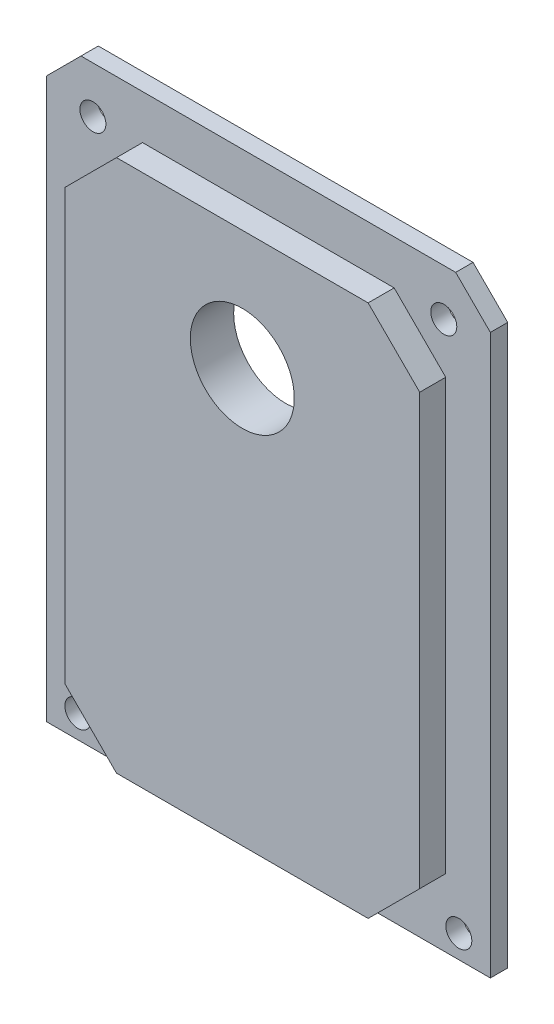
ISO-10303-21;
HEADER;
FILE_DESCRIPTION(('STEP AP214'),'2;1');
FILE_NAME('part.step','',(''),(''),'','','');
FILE_SCHEMA(('AUTOMOTIVE_DESIGN { 1 0 10303 214 1 1 1 1 }'));
ENDSEC;
DATA;
#1=APPLICATION_CONTEXT('core data for automotive mechanical design processes');
#2=APPLICATION_PROTOCOL_DEFINITION('international standard','automotive_design',2000,#1);
#3=PRODUCT_CONTEXT('',#1,'mechanical');
#4=PRODUCT('Part','Part','',(#3));
#5=PRODUCT_RELATED_PRODUCT_CATEGORY('part','',(#4));
#6=PRODUCT_DEFINITION_FORMATION('','',#4);
#7=PRODUCT_DEFINITION_CONTEXT('part definition',#1,'design');
#8=PRODUCT_DEFINITION('design','',#6,#7);
#9=PRODUCT_DEFINITION_SHAPE('','',#8);
#10=(LENGTH_UNIT() NAMED_UNIT(*) SI_UNIT(.MILLI.,.METRE.));
#11=(NAMED_UNIT(*) PLANE_ANGLE_UNIT() SI_UNIT($,.RADIAN.));
#12=(NAMED_UNIT(*) SI_UNIT($,.STERADIAN.) SOLID_ANGLE_UNIT());
#13=UNCERTAINTY_MEASURE_WITH_UNIT(LENGTH_MEASURE(1.E-05),#10,'distance_accuracy_value','');
#14=(GEOMETRIC_REPRESENTATION_CONTEXT(3) GLOBAL_UNCERTAINTY_ASSIGNED_CONTEXT((#13)) GLOBAL_UNIT_ASSIGNED_CONTEXT((#10,
#11,#12)) REPRESENTATION_CONTEXT('',''));
#15=CARTESIAN_POINT('',(0.,0.,0.));
#16=DIRECTION('',(0.,0.,1.));
#17=DIRECTION('',(1.,0.,0.));
#18=AXIS2_PLACEMENT_3D('',#15,#16,#17);
#19=CARTESIAN_POINT('',(0.,0.,2.));
#20=DIRECTION('',(0.,0.,-1.));
#21=DIRECTION('',(-1.,0.,0.));
#22=AXIS2_PLACEMENT_3D('',#19,#20,#21);
#23=PLANE('',#22);
#24=CARTESIAN_POINT('',(-21.9744235253127,-31.6049663646839,2.));
#25=DIRECTION('',(0.,0.,1.));
#26=DIRECTION('',(1.,0.,0.));
#27=AXIS2_PLACEMENT_3D('',#24,#25,#26);
#28=CIRCLE('',#27,1.5);
#29=CARTESIAN_POINT('',(-20.4744235253127,-31.6049663646839,2.));
#30=VERTEX_POINT('',#29);
#31=EDGE_CURVE('E528',#30,#30,#28,.T.);
#32=ORIENTED_EDGE('',*,*,#31,.F.);
#33=EDGE_LOOP('',(#32));
#34=FACE_BOUND('',#33,.T.);
#35=CARTESIAN_POINT('',(21.9744235253127,-31.6049663646839,2.));
#36=DIRECTION('',(0.,0.,1.));
#37=DIRECTION('',(1.,0.,0.));
#38=AXIS2_PLACEMENT_3D('',#35,#36,#37);
#39=CIRCLE('',#38,1.5);
#40=CARTESIAN_POINT('',(23.4744235253127,-31.6049663646839,2.));
#41=VERTEX_POINT('',#40);
#42=EDGE_CURVE('E544',#41,#41,#39,.T.);
#43=ORIENTED_EDGE('',*,*,#42,.F.);
#44=EDGE_LOOP('',(#43));
#45=FACE_BOUND('',#44,.T.);
#46=CARTESIAN_POINT('',(20.2421006537402,28.8771006537402,2.));
#47=DIRECTION('',(0.,0.,1.));
#48=DIRECTION('',(1.,0.,0.));
#49=AXIS2_PLACEMENT_3D('',#46,#47,#48);
#50=CIRCLE('',#49,1.5);
#51=CARTESIAN_POINT('',(21.7421006537402,28.8771006537402,2.));
#52=VERTEX_POINT('',#51);
#53=EDGE_CURVE('E536',#52,#52,#50,.T.);
#54=ORIENTED_EDGE('',*,*,#53,.F.);
#55=EDGE_LOOP('',(#54));
#56=FACE_BOUND('',#55,.T.);
#57=CARTESIAN_POINT('',(-20.2421006537402,28.8771006537402,2.));
#58=DIRECTION('',(0.,0.,1.));
#59=DIRECTION('',(1.,0.,0.));
#60=AXIS2_PLACEMENT_3D('',#57,#58,#59);
#61=CIRCLE('',#60,1.5);
#62=CARTESIAN_POINT('',(-18.7421006537402,28.8771006537402,2.));
#63=VERTEX_POINT('',#62);
#64=EDGE_CURVE('E535',#63,#63,#61,.T.);
#65=ORIENTED_EDGE('',*,*,#64,.F.);
#66=EDGE_LOOP('',(#65));
#67=FACE_BOUND('',#66,.T.);
#68=DIRECTION('',(0.,1.,0.));
#69=VECTOR('',#68,1.);
#70=CARTESIAN_POINT('',(25.615,-34.25,2.));
#71=LINE('',#70,#69);
#72=CARTESIAN_POINT('',(25.615,-34.25,2.));
#73=VERTEX_POINT('',#72);
#74=CARTESIAN_POINT('',(25.615,30.25,2.));
#75=VERTEX_POINT('',#74);
#76=EDGE_CURVE('E187',#73,#75,#71,.T.);
#77=ORIENTED_EDGE('',*,*,#76,.T.);
#78=DIRECTION('',(0.707106781186547,-0.707106781186548,0.));
#79=VECTOR('',#78,1.);
#80=CARTESIAN_POINT('',(21.615,34.25,2.));
#81=LINE('',#80,#79);
#82=CARTESIAN_POINT('',(21.615,34.25,2.));
#83=VERTEX_POINT('',#82);
#84=EDGE_CURVE('E206',#75,#83,#81,.F.);
#85=ORIENTED_EDGE('',*,*,#84,.T.);
#86=DIRECTION('',(-1.,0.,0.));
#87=VECTOR('',#86,1.);
#88=CARTESIAN_POINT('',(-25.615,34.25,2.));
#89=LINE('',#88,#87);
#90=CARTESIAN_POINT('',(-21.615,34.25,2.));
#91=VERTEX_POINT('',#90);
#92=EDGE_CURVE('E152',#83,#91,#89,.T.);
#93=ORIENTED_EDGE('',*,*,#92,.T.);
#94=DIRECTION('',(0.707106781186549,0.707106781186546,0.));
#95=VECTOR('',#94,1.);
#96=CARTESIAN_POINT('',(-25.615,30.25,2.));
#97=LINE('',#96,#95);
#98=CARTESIAN_POINT('',(-25.615,30.25,2.));
#99=VERTEX_POINT('',#98);
#100=EDGE_CURVE('E147',#91,#99,#97,.F.);
#101=ORIENTED_EDGE('',*,*,#100,.T.);
#102=DIRECTION('',(0.,-1.,0.));
#103=VECTOR('',#102,1.);
#104=CARTESIAN_POINT('',(-25.615,-34.25,2.));
#105=LINE('',#104,#103);
#106=CARTESIAN_POINT('',(-25.615,-34.25,2.));
#107=VERTEX_POINT('',#106);
#108=EDGE_CURVE('E139',#99,#107,#105,.T.);
#109=ORIENTED_EDGE('',*,*,#108,.T.);
#110=DIRECTION('',(1.,0.,0.));
#111=VECTOR('',#110,1.);
#112=CARTESIAN_POINT('',(-25.615,-34.25,2.));
#113=LINE('',#112,#111);
#114=EDGE_CURVE('E143',#107,#73,#113,.T.);
#115=ORIENTED_EDGE('',*,*,#114,.T.);
#116=EDGE_LOOP('',(#77,#85,#93,#101,#109,#115));
#117=FACE_BOUND('',#116,.T.);
#118=DIRECTION('',(0.,1.,0.));
#119=VECTOR('',#118,1.);
#120=CARTESIAN_POINT('',(20.465,-32.35,2.));
#121=LINE('',#120,#119);
#122=CARTESIAN_POINT('',(20.465,-26.4,2.));
#123=VERTEX_POINT('',#122);
#124=CARTESIAN_POINT('',(20.465,23.2,2.));
#125=VERTEX_POINT('',#124);
#126=EDGE_CURVE('E292',#123,#125,#121,.T.);
#127=ORIENTED_EDGE('',*,*,#126,.F.);
#128=DIRECTION('',(0.707106781186549,0.707106781186546,0.));
#129=VECTOR('',#128,1.);
#130=CARTESIAN_POINT('',(23.4324999999999,-23.4325000000001,2.));
#131=LINE('',#130,#129);
#132=CARTESIAN_POINT('',(14.515,-32.35,2.));
#133=VERTEX_POINT('',#132);
#134=EDGE_CURVE('E251',#123,#133,#131,.F.);
#135=ORIENTED_EDGE('',*,*,#134,.T.);
#136=DIRECTION('',(1.,0.,0.));
#137=VECTOR('',#136,1.);
#138=CARTESIAN_POINT('',(-20.465,-32.35,2.));
#139=LINE('',#138,#137);
#140=CARTESIAN_POINT('',(-14.515,-32.35,2.));
#141=VERTEX_POINT('',#140);
#142=EDGE_CURVE('E262',#141,#133,#139,.T.);
#143=ORIENTED_EDGE('',*,*,#142,.F.);
#144=DIRECTION('',(0.707106781186547,-0.707106781186548,0.));
#145=VECTOR('',#144,1.);
#146=CARTESIAN_POINT('',(-23.4325,-23.4325,2.));
#147=LINE('',#146,#145);
#148=CARTESIAN_POINT('',(-20.465,-26.4,2.));
#149=VERTEX_POINT('',#148);
#150=EDGE_CURVE('E254',#141,#149,#147,.F.);
#151=ORIENTED_EDGE('',*,*,#150,.T.);
#152=DIRECTION('',(0.,-1.,0.));
#153=VECTOR('',#152,1.);
#154=CARTESIAN_POINT('',(-20.465,-32.35,2.));
#155=LINE('',#154,#153);
#156=CARTESIAN_POINT('',(-20.465,23.2,2.));
#157=VERTEX_POINT('',#156);
#158=EDGE_CURVE('E260',#157,#149,#155,.T.);
#159=ORIENTED_EDGE('',*,*,#158,.F.);
#160=DIRECTION('',(-0.707106781186549,-0.707106781186546,0.));
#161=VECTOR('',#160,1.);
#162=CARTESIAN_POINT('',(-21.8325,21.8325000000001,2.));
#163=LINE('',#162,#161);
#164=CARTESIAN_POINT('',(-14.515,29.15,2.));
#165=VERTEX_POINT('',#164);
#166=EDGE_CURVE('E48',#157,#165,#163,.F.);
#167=ORIENTED_EDGE('',*,*,#166,.T.);
#168=DIRECTION('',(-1.,0.,0.));
#169=VECTOR('',#168,1.);
#170=CARTESIAN_POINT('',(-20.465,29.15,2.));
#171=LINE('',#170,#169);
#172=CARTESIAN_POINT('',(14.515,29.15,2.));
#173=VERTEX_POINT('',#172);
#174=EDGE_CURVE('E272',#173,#165,#171,.T.);
#175=ORIENTED_EDGE('',*,*,#174,.F.);
#176=DIRECTION('',(-0.707106781186547,0.707106781186548,0.));
#177=VECTOR('',#176,1.);
#178=CARTESIAN_POINT('',(21.8325,21.8325,2.));
#179=LINE('',#178,#177);
#180=EDGE_CURVE('E11',#173,#125,#179,.F.);
#181=ORIENTED_EDGE('',*,*,#180,.T.);
#182=EDGE_LOOP('',(#127,#135,#143,#151,#159,#167,#175,#181));
#183=FACE_BOUND('',#182,.T.);
#184=ADVANCED_FACE('F39',(#34,#45,#56,#67,#117,#183),#23,.F.);
#185=CARTESIAN_POINT('',(25.615,-34.25,2.));
#186=DIRECTION('',(-1.,0.,0.));
#187=DIRECTION('',(0.,0.,1.));
#188=AXIS2_PLACEMENT_3D('',#185,#186,#187);
#189=PLANE('',#188);
#190=DIRECTION('',(0.,1.,0.));
#191=VECTOR('',#190,1.);
#192=CARTESIAN_POINT('',(25.615,-34.25,0.));
#193=LINE('',#192,#191);
#194=CARTESIAN_POINT('',(25.615,-34.25,0.));
#195=VERTEX_POINT('',#194);
#196=CARTESIAN_POINT('',(25.615,30.25,0.));
#197=VERTEX_POINT('',#196);
#198=EDGE_CURVE('E174',#195,#197,#193,.T.);
#199=ORIENTED_EDGE('',*,*,#198,.T.);
#200=DIRECTION('',(0.,0.,1.));
#201=VECTOR('',#200,1.);
#202=CARTESIAN_POINT('',(25.615,30.25,2.));
#203=LINE('',#202,#201);
#204=EDGE_CURVE('E201',#197,#75,#203,.T.);
#205=ORIENTED_EDGE('',*,*,#204,.T.);
#206=ORIENTED_EDGE('',*,*,#76,.F.);
#207=DIRECTION('',(0.,0.,-1.));
#208=VECTOR('',#207,1.);
#209=CARTESIAN_POINT('',(25.615,-34.25,2.));
#210=LINE('',#209,#208);
#211=EDGE_CURVE('E163',#73,#195,#210,.T.);
#212=ORIENTED_EDGE('',*,*,#211,.T.);
#213=EDGE_LOOP('',(#199,#205,#206,#212));
#214=FACE_BOUND('',#213,.T.);
#215=ADVANCED_FACE('F316',(#214),#189,.F.);
#216=CARTESIAN_POINT('',(-25.615,34.25,2.));
#217=DIRECTION('',(0.,-1.,0.));
#218=DIRECTION('',(0.,0.,-1.));
#219=AXIS2_PLACEMENT_3D('',#216,#217,#218);
#220=PLANE('',#219);
#221=ORIENTED_EDGE('',*,*,#92,.F.);
#222=DIRECTION('',(0.,0.,-1.));
#223=VECTOR('',#222,1.);
#224=CARTESIAN_POINT('',(21.615,34.25,2.));
#225=LINE('',#224,#223);
#226=CARTESIAN_POINT('',(21.615,34.25,0.));
#227=VERTEX_POINT('',#226);
#228=EDGE_CURVE('E191',#83,#227,#225,.T.);
#229=ORIENTED_EDGE('',*,*,#228,.T.);
#230=DIRECTION('',(-1.,0.,0.));
#231=VECTOR('',#230,1.);
#232=CARTESIAN_POINT('',(-25.615,34.25,0.));
#233=LINE('',#232,#231);
#234=CARTESIAN_POINT('',(-21.615,34.25,0.));
#235=VERTEX_POINT('',#234);
#236=EDGE_CURVE('E178',#227,#235,#233,.T.);
#237=ORIENTED_EDGE('',*,*,#236,.T.);
#238=DIRECTION('',(0.,0.,1.));
#239=VECTOR('',#238,1.);
#240=CARTESIAN_POINT('',(-21.615,34.25,2.));
#241=LINE('',#240,#239);
#242=EDGE_CURVE('E162',#235,#91,#241,.T.);
#243=ORIENTED_EDGE('',*,*,#242,.T.);
#244=EDGE_LOOP('',(#221,#229,#237,#243));
#245=FACE_BOUND('',#244,.T.);
#246=ADVANCED_FACE('F320',(#245),#220,.F.);
#247=CARTESIAN_POINT('',(-25.615,-34.25,2.));
#248=DIRECTION('',(1.,0.,0.));
#249=DIRECTION('',(0.,0.,-1.));
#250=AXIS2_PLACEMENT_3D('',#247,#248,#249);
#251=PLANE('',#250);
#252=ORIENTED_EDGE('',*,*,#108,.F.);
#253=DIRECTION('',(0.,0.,-1.));
#254=VECTOR('',#253,1.);
#255=CARTESIAN_POINT('',(-25.615,30.25,2.));
#256=LINE('',#255,#254);
#257=CARTESIAN_POINT('',(-25.615,30.25,0.));
#258=VERTEX_POINT('',#257);
#259=EDGE_CURVE('E209',#99,#258,#256,.T.);
#260=ORIENTED_EDGE('',*,*,#259,.T.);
#261=DIRECTION('',(0.,-1.,0.));
#262=VECTOR('',#261,1.);
#263=CARTESIAN_POINT('',(-25.615,-34.25,0.));
#264=LINE('',#263,#262);
#265=CARTESIAN_POINT('',(-25.615,-34.25,0.));
#266=VERTEX_POINT('',#265);
#267=EDGE_CURVE('E158',#258,#266,#264,.T.);
#268=ORIENTED_EDGE('',*,*,#267,.T.);
#269=DIRECTION('',(0.,0.,-1.));
#270=VECTOR('',#269,1.);
#271=CARTESIAN_POINT('',(-25.615,-34.25,2.));
#272=LINE('',#271,#270);
#273=EDGE_CURVE('E155',#107,#266,#272,.T.);
#274=ORIENTED_EDGE('',*,*,#273,.F.);
#275=EDGE_LOOP('',(#252,#260,#268,#274));
#276=FACE_BOUND('',#275,.T.);
#277=ADVANCED_FACE('F156',(#276),#251,.F.);
#278=CARTESIAN_POINT('',(-25.615,-34.25,2.));
#279=DIRECTION('',(0.,1.,0.));
#280=DIRECTION('',(0.,0.,1.));
#281=AXIS2_PLACEMENT_3D('',#278,#279,#280);
#282=PLANE('',#281);
#283=DIRECTION('',(1.,0.,0.));
#284=VECTOR('',#283,1.);
#285=CARTESIAN_POINT('',(-25.615,-34.25,0.));
#286=LINE('',#285,#284);
#287=EDGE_CURVE('E185',#266,#195,#286,.T.);
#288=ORIENTED_EDGE('',*,*,#287,.T.);
#289=ORIENTED_EDGE('',*,*,#211,.F.);
#290=ORIENTED_EDGE('',*,*,#114,.F.);
#291=ORIENTED_EDGE('',*,*,#273,.T.);
#292=EDGE_LOOP('',(#288,#289,#290,#291));
#293=FACE_BOUND('',#292,.T.);
#294=ADVANCED_FACE('F165',(#293),#282,.F.);
#295=CARTESIAN_POINT('',(0.,0.,0.));
#296=DIRECTION('',(0.,0.,-1.));
#297=DIRECTION('',(-1.,0.,0.));
#298=AXIS2_PLACEMENT_3D('',#295,#296,#297);
#299=PLANE('',#298);
#300=CARTESIAN_POINT('',(0.,15.35,0.));
#301=DIRECTION('',(0.,0.,-1.));
#302=DIRECTION('',(-1.,0.,0.));
#303=AXIS2_PLACEMENT_3D('',#300,#301,#302);
#304=CIRCLE('',#303,6.);
#305=CARTESIAN_POINT('',(-6.,15.35,0.));
#306=VERTEX_POINT('',#305);
#307=EDGE_CURVE('E524',#306,#306,#304,.T.);
#308=ORIENTED_EDGE('',*,*,#307,.F.);
#309=EDGE_LOOP('',(#308));
#310=FACE_BOUND('',#309,.T.);
#311=CARTESIAN_POINT('',(-21.9744235253127,-31.6049663646839,0.));
#312=DIRECTION('',(0.,0.,1.));
#313=DIRECTION('',(1.,0.,0.));
#314=AXIS2_PLACEMENT_3D('',#311,#312,#313);
#315=CIRCLE('',#314,1.5);
#316=CARTESIAN_POINT('',(-20.4744235253127,-31.6049663646839,0.));
#317=VERTEX_POINT('',#316);
#318=EDGE_CURVE('E548',#317,#317,#315,.T.);
#319=ORIENTED_EDGE('',*,*,#318,.T.);
#320=EDGE_LOOP('',(#319));
#321=FACE_BOUND('',#320,.T.);
#322=CARTESIAN_POINT('',(21.9744235253127,-31.6049663646839,0.));
#323=DIRECTION('',(0.,0.,1.));
#324=DIRECTION('',(1.,0.,0.));
#325=AXIS2_PLACEMENT_3D('',#322,#323,#324);
#326=CIRCLE('',#325,1.5);
#327=CARTESIAN_POINT('',(23.4744235253127,-31.6049663646839,0.));
#328=VERTEX_POINT('',#327);
#329=EDGE_CURVE('E540',#328,#328,#326,.T.);
#330=ORIENTED_EDGE('',*,*,#329,.T.);
#331=EDGE_LOOP('',(#330));
#332=FACE_BOUND('',#331,.T.);
#333=CARTESIAN_POINT('',(20.2421006537402,28.8771006537402,0.));
#334=DIRECTION('',(0.,0.,1.));
#335=DIRECTION('',(1.,0.,0.));
#336=AXIS2_PLACEMENT_3D('',#333,#334,#335);
#337=CIRCLE('',#336,1.5);
#338=CARTESIAN_POINT('',(21.7421006537402,28.8771006537402,0.));
#339=VERTEX_POINT('',#338);
#340=EDGE_CURVE('E531',#339,#339,#337,.T.);
#341=ORIENTED_EDGE('',*,*,#340,.T.);
#342=EDGE_LOOP('',(#341));
#343=FACE_BOUND('',#342,.T.);
#344=CARTESIAN_POINT('',(-20.2421006537402,28.8771006537402,0.));
#345=DIRECTION('',(0.,0.,1.));
#346=DIRECTION('',(1.,0.,0.));
#347=AXIS2_PLACEMENT_3D('',#344,#345,#346);
#348=CIRCLE('',#347,1.5);
#349=CARTESIAN_POINT('',(-18.7421006537402,28.8771006537402,0.));
#350=VERTEX_POINT('',#349);
#351=EDGE_CURVE('E296',#350,#350,#348,.T.);
#352=ORIENTED_EDGE('',*,*,#351,.T.);
#353=EDGE_LOOP('',(#352));
#354=FACE_BOUND('',#353,.T.);
#355=ORIENTED_EDGE('',*,*,#236,.F.);
#356=DIRECTION('',(-0.707106781186547,0.707106781186548,0.));
#357=VECTOR('',#356,1.);
#358=CARTESIAN_POINT('',(27.9325,27.9325,0.));
#359=LINE('',#358,#357);
#360=EDGE_CURVE('E198',#227,#197,#359,.F.);
#361=ORIENTED_EDGE('',*,*,#360,.T.);
#362=ORIENTED_EDGE('',*,*,#198,.F.);
#363=ORIENTED_EDGE('',*,*,#287,.F.);
#364=ORIENTED_EDGE('',*,*,#267,.F.);
#365=DIRECTION('',(-0.707106781186549,-0.707106781186546,0.));
#366=VECTOR('',#365,1.);
#367=CARTESIAN_POINT('',(-27.9324999999999,27.9325000000001,0.));
#368=LINE('',#367,#366);
#369=EDGE_CURVE('E195',#258,#235,#368,.F.);
#370=ORIENTED_EDGE('',*,*,#369,.T.);
#371=EDGE_LOOP('',(#355,#361,#362,#363,#364,#370));
#372=FACE_BOUND('',#371,.T.);
#373=ADVANCED_FACE('F313',(#310,#321,#332,#343,#354,#372),#299,.T.);
#374=CARTESIAN_POINT('',(21.615,34.25,2.));
#375=DIRECTION('',(-0.707106781186548,-0.707106781186547,0.));
#376=DIRECTION('',(0.,0.,-1.));
#377=AXIS2_PLACEMENT_3D('',#374,#375,#376);
#378=PLANE('',#377);
#379=ORIENTED_EDGE('',*,*,#84,.F.);
#380=ORIENTED_EDGE('',*,*,#204,.F.);
#381=ORIENTED_EDGE('',*,*,#360,.F.);
#382=ORIENTED_EDGE('',*,*,#228,.F.);
#383=EDGE_LOOP('',(#379,#380,#381,#382));
#384=FACE_BOUND('',#383,.T.);
#385=ADVANCED_FACE('F319',(#384),#378,.F.);
#386=CARTESIAN_POINT('',(-25.615,30.25,2.));
#387=DIRECTION('',(0.707106781186546,-0.707106781186549,0.));
#388=DIRECTION('',(0.,0.,-1.));
#389=AXIS2_PLACEMENT_3D('',#386,#387,#388);
#390=PLANE('',#389);
#391=ORIENTED_EDGE('',*,*,#100,.F.);
#392=ORIENTED_EDGE('',*,*,#242,.F.);
#393=ORIENTED_EDGE('',*,*,#369,.F.);
#394=ORIENTED_EDGE('',*,*,#259,.F.);
#395=EDGE_LOOP('',(#391,#392,#393,#394));
#396=FACE_BOUND('',#395,.T.);
#397=ADVANCED_FACE('F310',(#396),#390,.F.);
#398=CARTESIAN_POINT('',(20.465,-32.35,5.));
#399=DIRECTION('',(-1.,0.,0.));
#400=DIRECTION('',(0.,-1.,0.));
#401=AXIS2_PLACEMENT_3D('',#398,#399,#400);
#402=PLANE('',#401);
#403=DIRECTION('',(0.,1.,0.));
#404=VECTOR('',#403,1.);
#405=CARTESIAN_POINT('',(20.465,-32.35,5.));
#406=LINE('',#405,#404);
#407=CARTESIAN_POINT('',(20.465,-26.4,5.));
#408=VERTEX_POINT('',#407);
#409=CARTESIAN_POINT('',(20.465,23.2,5.));
#410=VERTEX_POINT('',#409);
#411=EDGE_CURVE('E301',#408,#410,#406,.T.);
#412=ORIENTED_EDGE('',*,*,#411,.F.);
#413=DIRECTION('',(0.,0.,-1.));
#414=VECTOR('',#413,1.);
#415=CARTESIAN_POINT('',(20.465,-26.4,5.));
#416=LINE('',#415,#414);
#417=EDGE_CURVE('E215',#408,#123,#416,.T.);
#418=ORIENTED_EDGE('',*,*,#417,.T.);
#419=ORIENTED_EDGE('',*,*,#126,.T.);
#420=DIRECTION('',(0.,0.,1.));
#421=VECTOR('',#420,1.);
#422=CARTESIAN_POINT('',(20.465,23.2,5.));
#423=LINE('',#422,#421);
#424=EDGE_CURVE('E212',#125,#410,#423,.T.);
#425=ORIENTED_EDGE('',*,*,#424,.T.);
#426=EDGE_LOOP('',(#412,#418,#419,#425));
#427=FACE_BOUND('',#426,.T.);
#428=ADVANCED_FACE('F338',(#427),#402,.F.);
#429=CARTESIAN_POINT('',(-20.465,29.15,5.));
#430=DIRECTION('',(0.,-1.,0.));
#431=DIRECTION('',(0.,0.,-1.));
#432=AXIS2_PLACEMENT_3D('',#429,#430,#431);
#433=PLANE('',#432);
#434=ORIENTED_EDGE('',*,*,#174,.T.);
#435=DIRECTION('',(0.,0.,1.));
#436=VECTOR('',#435,1.);
#437=CARTESIAN_POINT('',(-14.515,29.15,5.));
#438=LINE('',#437,#436);
#439=CARTESIAN_POINT('',(-14.515,29.15,5.));
#440=VERTEX_POINT('',#439);
#441=EDGE_CURVE('E248',#165,#440,#438,.T.);
#442=ORIENTED_EDGE('',*,*,#441,.T.);
#443=DIRECTION('',(-1.,0.,0.));
#444=VECTOR('',#443,1.);
#445=CARTESIAN_POINT('',(-20.465,29.15,5.));
#446=LINE('',#445,#444);
#447=CARTESIAN_POINT('',(14.515,29.15,5.));
#448=VERTEX_POINT('',#447);
#449=EDGE_CURVE('E288',#448,#440,#446,.T.);
#450=ORIENTED_EDGE('',*,*,#449,.F.);
#451=DIRECTION('',(0.,0.,-1.));
#452=VECTOR('',#451,1.);
#453=CARTESIAN_POINT('',(14.515,29.15,5.));
#454=LINE('',#453,#452);
#455=EDGE_CURVE('E245',#448,#173,#454,.T.);
#456=ORIENTED_EDGE('',*,*,#455,.T.);
#457=EDGE_LOOP('',(#434,#442,#450,#456));
#458=FACE_BOUND('',#457,.T.);
#459=ADVANCED_FACE('F373',(#458),#433,.F.);
#460=CARTESIAN_POINT('',(-20.465,-32.35,5.));
#461=DIRECTION('',(1.,0.,0.));
#462=DIRECTION('',(0.,0.,-1.));
#463=AXIS2_PLACEMENT_3D('',#460,#461,#462);
#464=PLANE('',#463);
#465=ORIENTED_EDGE('',*,*,#158,.T.);
#466=DIRECTION('',(0.,0.,1.));
#467=VECTOR('',#466,1.);
#468=CARTESIAN_POINT('',(-20.465,-26.4,5.));
#469=LINE('',#468,#467);
#470=CARTESIAN_POINT('',(-20.465,-26.4,5.));
#471=VERTEX_POINT('',#470);
#472=EDGE_CURVE('E242',#149,#471,#469,.T.);
#473=ORIENTED_EDGE('',*,*,#472,.T.);
#474=DIRECTION('',(0.,-1.,0.));
#475=VECTOR('',#474,1.);
#476=CARTESIAN_POINT('',(-20.465,-32.35,5.));
#477=LINE('',#476,#475);
#478=CARTESIAN_POINT('',(-20.465,23.2,5.));
#479=VERTEX_POINT('',#478);
#480=EDGE_CURVE('E281',#479,#471,#477,.T.);
#481=ORIENTED_EDGE('',*,*,#480,.F.);
#482=DIRECTION('',(0.,0.,-1.));
#483=VECTOR('',#482,1.);
#484=CARTESIAN_POINT('',(-20.465,23.2,5.));
#485=LINE('',#484,#483);
#486=EDGE_CURVE('E238',#479,#157,#485,.T.);
#487=ORIENTED_EDGE('',*,*,#486,.T.);
#488=EDGE_LOOP('',(#465,#473,#481,#487));
#489=FACE_BOUND('',#488,.T.);
#490=ADVANCED_FACE('F267',(#489),#464,.F.);
#491=CARTESIAN_POINT('',(-20.465,-32.35,5.));
#492=DIRECTION('',(0.,1.,0.));
#493=DIRECTION('',(0.,0.,1.));
#494=AXIS2_PLACEMENT_3D('',#491,#492,#493);
#495=PLANE('',#494);
#496=ORIENTED_EDGE('',*,*,#142,.T.);
#497=DIRECTION('',(0.,0.,1.));
#498=VECTOR('',#497,1.);
#499=CARTESIAN_POINT('',(14.515,-32.35,5.));
#500=LINE('',#499,#498);
#501=CARTESIAN_POINT('',(14.515,-32.35,5.));
#502=VERTEX_POINT('',#501);
#503=EDGE_CURVE('E223',#133,#502,#500,.T.);
#504=ORIENTED_EDGE('',*,*,#503,.T.);
#505=DIRECTION('',(1.,0.,0.));
#506=VECTOR('',#505,1.);
#507=CARTESIAN_POINT('',(-20.465,-32.35,5.));
#508=LINE('',#507,#506);
#509=CARTESIAN_POINT('',(-14.515,-32.35,5.));
#510=VERTEX_POINT('',#509);
#511=EDGE_CURVE('E179',#510,#502,#508,.T.);
#512=ORIENTED_EDGE('',*,*,#511,.F.);
#513=DIRECTION('',(0.,0.,-1.));
#514=VECTOR('',#513,1.);
#515=CARTESIAN_POINT('',(-14.515,-32.35,5.));
#516=LINE('',#515,#514);
#517=EDGE_CURVE('E219',#510,#141,#516,.T.);
#518=ORIENTED_EDGE('',*,*,#517,.T.);
#519=EDGE_LOOP('',(#496,#504,#512,#518));
#520=FACE_BOUND('',#519,.T.);
#521=ADVANCED_FACE('F283',(#520),#495,.F.);
#522=CARTESIAN_POINT('',(0.,0.,5.));
#523=DIRECTION('',(0.,0.,-1.));
#524=DIRECTION('',(-1.,0.,0.));
#525=AXIS2_PLACEMENT_3D('',#522,#523,#524);
#526=PLANE('',#525);
#527=CARTESIAN_POINT('',(0.,15.35,5.));
#528=DIRECTION('',(0.,0.,-1.));
#529=DIRECTION('',(-1.,0.,0.));
#530=AXIS2_PLACEMENT_3D('',#527,#528,#529);
#531=CIRCLE('',#530,6.);
#532=CARTESIAN_POINT('',(-6.,15.35,5.));
#533=VERTEX_POINT('',#532);
#534=EDGE_CURVE('E521',#533,#533,#531,.T.);
#535=ORIENTED_EDGE('',*,*,#534,.T.);
#536=EDGE_LOOP('',(#535));
#537=FACE_BOUND('',#536,.T.);
#538=ORIENTED_EDGE('',*,*,#511,.T.);
#539=DIRECTION('',(-0.707106781186549,-0.707106781186546,0.));
#540=VECTOR('',#539,1.);
#541=CARTESIAN_POINT('',(20.465,-26.4,5.));
#542=LINE('',#541,#540);
#543=EDGE_CURVE('E235',#502,#408,#542,.F.);
#544=ORIENTED_EDGE('',*,*,#543,.T.);
#545=ORIENTED_EDGE('',*,*,#411,.T.);
#546=DIRECTION('',(0.707106781186547,-0.707106781186548,0.));
#547=VECTOR('',#546,1.);
#548=CARTESIAN_POINT('',(14.515,29.15,5.));
#549=LINE('',#548,#547);
#550=EDGE_CURVE('E226',#410,#448,#549,.F.);
#551=ORIENTED_EDGE('',*,*,#550,.T.);
#552=ORIENTED_EDGE('',*,*,#449,.T.);
#553=DIRECTION('',(0.707106781186549,0.707106781186546,0.));
#554=VECTOR('',#553,1.);
#555=CARTESIAN_POINT('',(-20.465,23.2,5.));
#556=LINE('',#555,#554);
#557=EDGE_CURVE('E229',#440,#479,#556,.F.);
#558=ORIENTED_EDGE('',*,*,#557,.T.);
#559=ORIENTED_EDGE('',*,*,#480,.T.);
#560=DIRECTION('',(-0.707106781186547,0.707106781186548,0.));
#561=VECTOR('',#560,1.);
#562=CARTESIAN_POINT('',(-14.515,-32.35,5.));
#563=LINE('',#562,#561);
#564=EDGE_CURVE('E232',#471,#510,#563,.F.);
#565=ORIENTED_EDGE('',*,*,#564,.T.);
#566=EDGE_LOOP('',(#538,#544,#545,#551,#552,#558,#559,#565));
#567=FACE_BOUND('',#566,.T.);
#568=ADVANCED_FACE('F279',(#537,#567),#526,.F.);
#569=CARTESIAN_POINT('',(20.465,-26.4,5.));
#570=DIRECTION('',(-0.707106781186546,0.707106781186549,0.));
#571=DIRECTION('',(0.,0.,-1.));
#572=AXIS2_PLACEMENT_3D('',#569,#570,#571);
#573=PLANE('',#572);
#574=ORIENTED_EDGE('',*,*,#543,.F.);
#575=ORIENTED_EDGE('',*,*,#503,.F.);
#576=ORIENTED_EDGE('',*,*,#134,.F.);
#577=ORIENTED_EDGE('',*,*,#417,.F.);
#578=EDGE_LOOP('',(#574,#575,#576,#577));
#579=FACE_BOUND('',#578,.T.);
#580=ADVANCED_FACE('F398',(#579),#573,.F.);
#581=CARTESIAN_POINT('',(-14.515,-32.35,5.));
#582=DIRECTION('',(0.707106781186548,0.707106781186547,0.));
#583=DIRECTION('',(0.,0.,-1.));
#584=AXIS2_PLACEMENT_3D('',#581,#582,#583);
#585=PLANE('',#584);
#586=ORIENTED_EDGE('',*,*,#564,.F.);
#587=ORIENTED_EDGE('',*,*,#472,.F.);
#588=ORIENTED_EDGE('',*,*,#150,.F.);
#589=ORIENTED_EDGE('',*,*,#517,.F.);
#590=EDGE_LOOP('',(#586,#587,#588,#589));
#591=FACE_BOUND('',#590,.T.);
#592=ADVANCED_FACE('F275',(#591),#585,.F.);
#593=CARTESIAN_POINT('',(-20.465,23.2,5.));
#594=DIRECTION('',(0.707106781186546,-0.707106781186549,0.));
#595=DIRECTION('',(0.,0.,-1.));
#596=AXIS2_PLACEMENT_3D('',#593,#594,#595);
#597=PLANE('',#596);
#598=ORIENTED_EDGE('',*,*,#557,.F.);
#599=ORIENTED_EDGE('',*,*,#441,.F.);
#600=ORIENTED_EDGE('',*,*,#166,.F.);
#601=ORIENTED_EDGE('',*,*,#486,.F.);
#602=EDGE_LOOP('',(#598,#599,#600,#601));
#603=FACE_BOUND('',#602,.T.);
#604=ADVANCED_FACE('F413',(#603),#597,.F.);
#605=CARTESIAN_POINT('',(14.515,29.15,5.));
#606=DIRECTION('',(-0.707106781186548,-0.707106781186547,0.));
#607=DIRECTION('',(0.,0.,-1.));
#608=AXIS2_PLACEMENT_3D('',#605,#606,#607);
#609=PLANE('',#608);
#610=ORIENTED_EDGE('',*,*,#550,.F.);
#611=ORIENTED_EDGE('',*,*,#424,.F.);
#612=ORIENTED_EDGE('',*,*,#180,.F.);
#613=ORIENTED_EDGE('',*,*,#455,.F.);
#614=EDGE_LOOP('',(#610,#611,#612,#613));
#615=FACE_BOUND('',#614,.T.);
#616=ADVANCED_FACE('F41',(#615),#609,.F.);
#617=CARTESIAN_POINT('',(-20.2421006537402,28.8771006537402,0.));
#618=DIRECTION('',(0.,0.,1.));
#619=DIRECTION('',(1.,0.,0.));
#620=AXIS2_PLACEMENT_3D('',#617,#618,#619);
#621=CYLINDRICAL_SURFACE('',#620,1.5);
#622=ORIENTED_EDGE('',*,*,#351,.F.);
#623=EDGE_LOOP('',(#622));
#624=FACE_BOUND('',#623,.T.);
#625=ORIENTED_EDGE('',*,*,#64,.T.);
#626=EDGE_LOOP('',(#625));
#627=FACE_BOUND('',#626,.T.);
#628=ADVANCED_FACE('F426',(#624,#627),#621,.F.);
#629=CARTESIAN_POINT('',(20.2421006537402,28.8771006537402,0.));
#630=DIRECTION('',(0.,0.,1.));
#631=DIRECTION('',(1.,0.,0.));
#632=AXIS2_PLACEMENT_3D('',#629,#630,#631);
#633=CYLINDRICAL_SURFACE('',#632,1.5);
#634=ORIENTED_EDGE('',*,*,#340,.F.);
#635=EDGE_LOOP('',(#634));
#636=FACE_BOUND('',#635,.T.);
#637=ORIENTED_EDGE('',*,*,#53,.T.);
#638=EDGE_LOOP('',(#637));
#639=FACE_BOUND('',#638,.T.);
#640=ADVANCED_FACE('F432',(#636,#639),#633,.F.);
#641=CARTESIAN_POINT('',(21.9744235253127,-31.6049663646839,0.));
#642=DIRECTION('',(0.,0.,1.));
#643=DIRECTION('',(1.,0.,0.));
#644=AXIS2_PLACEMENT_3D('',#641,#642,#643);
#645=CYLINDRICAL_SURFACE('',#644,1.5);
#646=ORIENTED_EDGE('',*,*,#329,.F.);
#647=EDGE_LOOP('',(#646));
#648=FACE_BOUND('',#647,.T.);
#649=ORIENTED_EDGE('',*,*,#42,.T.);
#650=EDGE_LOOP('',(#649));
#651=FACE_BOUND('',#650,.T.);
#652=ADVANCED_FACE('F440',(#648,#651),#645,.F.);
#653=CARTESIAN_POINT('',(-21.9744235253127,-31.6049663646839,0.));
#654=DIRECTION('',(0.,0.,1.));
#655=DIRECTION('',(1.,0.,0.));
#656=AXIS2_PLACEMENT_3D('',#653,#654,#655);
#657=CYLINDRICAL_SURFACE('',#656,1.5);
#658=ORIENTED_EDGE('',*,*,#318,.F.);
#659=EDGE_LOOP('',(#658));
#660=FACE_BOUND('',#659,.T.);
#661=ORIENTED_EDGE('',*,*,#31,.T.);
#662=EDGE_LOOP('',(#661));
#663=FACE_BOUND('',#662,.T.);
#664=ADVANCED_FACE('F448',(#660,#663),#657,.F.);
#665=CARTESIAN_POINT('',(0.,15.35,5.));
#666=DIRECTION('',(0.,0.,-1.));
#667=DIRECTION('',(-1.,0.,0.));
#668=AXIS2_PLACEMENT_3D('',#665,#666,#667);
#669=CYLINDRICAL_SURFACE('',#668,6.);
#670=ORIENTED_EDGE('',*,*,#534,.F.);
#671=EDGE_LOOP('',(#670));
#672=FACE_BOUND('',#671,.T.);
#673=ORIENTED_EDGE('',*,*,#307,.T.);
#674=EDGE_LOOP('',(#673));
#675=FACE_BOUND('',#674,.T.);
#676=ADVANCED_FACE('F455',(#672,#675),#669,.F.);
#677=CLOSED_SHELL('',(#184,#215,#246,#277,#294,#373,#385,#397,#428,#459,#490,#521,#568,#580,
#592,#604,#616,#628,#640,#652,#664,#676));
#678=MANIFOLD_SOLID_BREP('B2',#677);
#679=ADVANCED_BREP_SHAPE_REPRESENTATION('',(#18,#678),#14);
#680=SHAPE_DEFINITION_REPRESENTATION(#9,#679);
ENDSEC;
END-ISO-10303-21;
